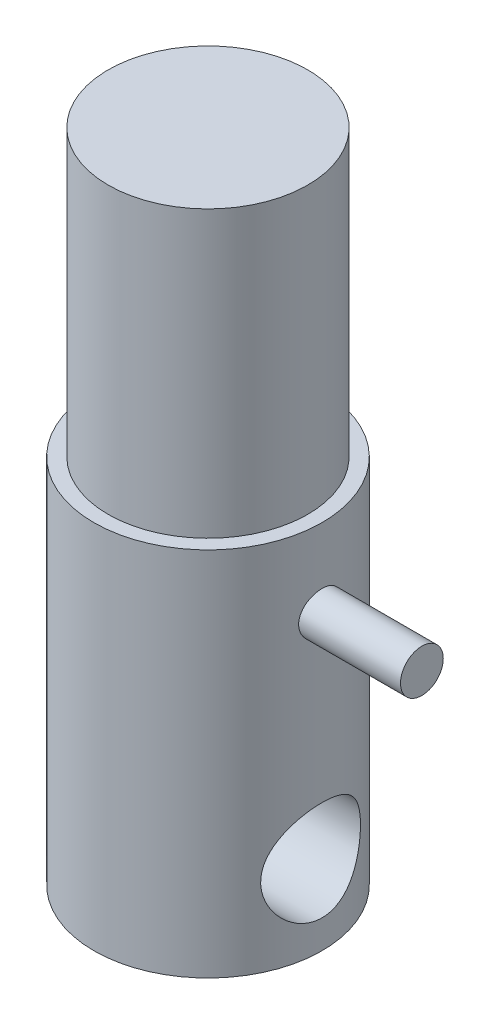
ISO-10303-21;
HEADER;
FILE_DESCRIPTION(('STEP AP214'),'2;1');
FILE_NAME('part.step','',(''),(''),'','','');
FILE_SCHEMA(('AUTOMOTIVE_DESIGN { 1 0 10303 214 1 1 1 1 }'));
ENDSEC;
DATA;
#1=APPLICATION_CONTEXT('core data for automotive mechanical design processes');
#2=APPLICATION_PROTOCOL_DEFINITION('international standard','automotive_design',2000,#1);
#3=PRODUCT_CONTEXT('',#1,'mechanical');
#4=PRODUCT('Part','Part','',(#3));
#5=PRODUCT_RELATED_PRODUCT_CATEGORY('part','',(#4));
#6=PRODUCT_DEFINITION_FORMATION('','',#4);
#7=PRODUCT_DEFINITION_CONTEXT('part definition',#1,'design');
#8=PRODUCT_DEFINITION('design','',#6,#7);
#9=PRODUCT_DEFINITION_SHAPE('','',#8);
#10=(LENGTH_UNIT() NAMED_UNIT(*) SI_UNIT(.MILLI.,.METRE.));
#11=(NAMED_UNIT(*) PLANE_ANGLE_UNIT() SI_UNIT($,.RADIAN.));
#12=(NAMED_UNIT(*) SI_UNIT($,.STERADIAN.) SOLID_ANGLE_UNIT());
#13=UNCERTAINTY_MEASURE_WITH_UNIT(LENGTH_MEASURE(1.E-05),#10,'distance_accuracy_value','');
#14=(GEOMETRIC_REPRESENTATION_CONTEXT(3) GLOBAL_UNCERTAINTY_ASSIGNED_CONTEXT((#13)) GLOBAL_UNIT_ASSIGNED_CONTEXT((#10,
#11,#12)) REPRESENTATION_CONTEXT('',''));
#15=CARTESIAN_POINT('',(0.,0.,0.));
#16=DIRECTION('',(0.,0.,1.));
#17=DIRECTION('',(1.,0.,0.));
#18=AXIS2_PLACEMENT_3D('',#15,#16,#17);
#19=CARTESIAN_POINT('',(0.,26.,0.));
#20=DIRECTION('',(0.,-1.,0.));
#21=DIRECTION('',(0.,0.,-1.));
#22=AXIS2_PLACEMENT_3D('',#19,#20,#21);
#23=CYLINDRICAL_SURFACE('',#22,8.);
#24=CARTESIAN_POINT('',(-8.,2.,0.));
#25=CARTESIAN_POINT('',(-7.99999940745694,2.00000072776569,-0.0933666233384851));
#26=CARTESIAN_POINT('',(-7.9983610310427,2.00374114328425,-0.186759270174456));
#27=CARTESIAN_POINT('',(-7.99184884919447,2.01866528787146,-0.372872749123498));
#28=CARTESIAN_POINT('',(-7.98697314459621,2.02985338610016,-0.465593154572551));
#29=CARTESIAN_POINT('',(-7.97410005318315,2.05958530422893,-0.649818158985985));
#30=CARTESIAN_POINT('',(-7.96609668064456,2.07814322959752,-0.741320076696438));
#31=CARTESIAN_POINT('',(-7.94718176432595,2.12241334749227,-0.922281183072893));
#32=CARTESIAN_POINT('',(-7.93626903181754,2.14812846454748,-1.01173952049993));
#33=CARTESIAN_POINT('',(-7.8996564478936,2.23543171716823,-1.27542538874324));
#34=CARTESIAN_POINT('',(-7.87001818767712,2.30731913041274,-1.44582497530953));
#35=CARTESIAN_POINT('',(-7.80309271058877,2.4760575708123,-1.77187524727301));
#36=CARTESIAN_POINT('',(-7.76580738177035,2.57290243750859,-1.92752955942217));
#37=CARTESIAN_POINT('',(-7.68500313686328,2.79437449119043,-2.22849129689962));
#38=CARTESIAN_POINT('',(-7.64126685323877,2.92014077858952,-2.3729035023048));
#39=CARTESIAN_POINT('',(-7.55337918697325,3.19342204187393,-2.63935464804969));
#40=CARTESIAN_POINT('',(-7.50922757985992,3.34094949652132,-2.76138066052511));
#41=CARTESIAN_POINT('',(-7.42272790432067,3.6636342561432,-2.98637987771685));
#42=CARTESIAN_POINT('',(-7.38061606388429,3.83987082055633,-3.0879191314078));
#43=CARTESIAN_POINT('',(-7.32501692307065,4.11649644908337,-3.21656730984867));
#44=CARTESIAN_POINT('',(-7.30774025006469,4.21078782451872,-3.25551675909755));
#45=CARTESIAN_POINT('',(-7.27631558892907,4.40285831757203,-3.32516065933081));
#46=CARTESIAN_POINT('',(-7.26216594101907,4.5006355527825,-3.35585949150439));
#47=CARTESIAN_POINT('',(-7.23817142209289,4.69387047188347,-3.4072920277405));
#48=CARTESIAN_POINT('',(-7.22814362009983,4.78919162392814,-3.42845456085262));
#49=CARTESIAN_POINT('',(-7.21177013630988,4.98153652176254,-3.46276381557314));
#50=CARTESIAN_POINT('',(-7.20542269978883,5.0785594334169,-3.47591435728978));
#51=CARTESIAN_POINT('',(-7.19665363004014,5.27351879851523,-3.49403523986675));
#52=CARTESIAN_POINT('',(-7.1942307225408,5.37145494504514,-3.49900823593647));
#53=CARTESIAN_POINT('',(-7.19339383537363,5.56738614351159,-3.50072458650871));
#54=CARTESIAN_POINT('',(-7.19497961060603,5.6653811914805,-3.49746844415904));
#55=CARTESIAN_POINT('',(-7.20508193766051,5.94133960493196,-3.4766519728511));
#56=CARTESIAN_POINT('',(-7.21824024837257,6.11851852257941,-3.44950030503525));
#57=CARTESIAN_POINT('',(-7.2561765532029,6.46538229734021,-3.36894953544146));
#58=CARTESIAN_POINT('',(-7.28095705439998,6.63506552887732,-3.3155447703615));
#59=CARTESIAN_POINT('',(-7.33989995610935,6.96675561879333,-3.18295826773355));
#60=CARTESIAN_POINT('',(-7.37425836136428,7.12850854629243,-3.10323077266952));
#61=CARTESIAN_POINT('',(-7.44845615501834,7.43700203170891,-2.92064956725936));
#62=CARTESIAN_POINT('',(-7.48829781531941,7.58373632271414,-2.81778625968343));
#63=CARTESIAN_POINT('',(-7.57352503128819,7.87256977145236,-2.58051119968252));
#64=CARTESIAN_POINT('',(-7.61907951125158,8.01293402132747,-2.44404178627651));
#65=CARTESIAN_POINT('',(-7.70746776961742,8.26939989092557,-2.14909967075973));
#66=CARTESIAN_POINT('',(-7.75030077257194,8.38549461676629,-1.99062073795121));
#67=CARTESIAN_POINT('',(-7.82990525792128,8.59303595507949,-1.65042312625341));
#68=CARTESIAN_POINT('',(-7.86647502935365,8.68370726769191,-1.46818069446751));
#69=CARTESIAN_POINT('',(-7.92785093023804,8.83248275917373,-1.08901847833019));
#70=CARTESIAN_POINT('',(-7.95266424157327,8.89060682473099,-0.892107739984553));
#71=CARTESIAN_POINT('',(-7.98634708358691,8.96884574673018,-0.503637618390162));
#72=CARTESIAN_POINT('',(-7.99618954872041,8.99128483256231,-0.312630833697039));
#73=CARTESIAN_POINT('',(-8.00198066611261,9.0045317898191,0.070660162758491));
#74=CARTESIAN_POINT('',(-7.99793384423919,8.99534996501364,0.262943938029492));
#75=CARTESIAN_POINT('',(-7.97702184221024,8.94721540381594,0.631984322613553));
#76=CARTESIAN_POINT('',(-7.96088593111326,8.90995573218512,0.809008015466778));
#77=CARTESIAN_POINT('',(-7.91823126268307,8.80914858685033,1.15406028529729));
#78=CARTESIAN_POINT('',(-7.89171122989916,8.74559788384314,1.32208775441223));
#79=CARTESIAN_POINT('',(-7.82976301960118,8.59196921041588,1.65033132337633));
#80=CARTESIAN_POINT('',(-7.79408238501599,8.50112439872629,1.81013928918031));
#81=CARTESIAN_POINT('',(-7.71753886001168,8.29632276718931,2.11281959223004));
#82=CARTESIAN_POINT('',(-7.67667373216661,8.18235595598548,2.25568456572717));
#83=CARTESIAN_POINT('',(-7.59015886424924,7.92413599247671,2.53221082051266));
#84=CARTESIAN_POINT('',(-7.54438505468226,7.77820993718209,2.66427505427857));
#85=CARTESIAN_POINT('',(-7.4559619109918,7.46565728970526,2.90255447133245));
#86=CARTESIAN_POINT('',(-7.41331357936267,7.29902410152598,3.00876138605279));
#87=CARTESIAN_POINT('',(-7.33536965936314,6.94499611802928,3.19416927523349));
#88=CARTESIAN_POINT('',(-7.30024707484556,6.75723913291564,3.27275701612806));
#89=CARTESIAN_POINT('',(-7.24352853325891,6.36912143404663,3.39647014281916));
#90=CARTESIAN_POINT('',(-7.22191987363783,6.16877275156054,3.44162695971624));
#91=CARTESIAN_POINT('',(-7.19675148830959,5.77904723701151,3.49392806332877));
#92=CARTESIAN_POINT('',(-7.19184395387172,5.59013780246139,3.50391337012318));
#93=CARTESIAN_POINT('',(-7.19699182683936,5.21340575258161,3.49332929204513));
#94=CARTESIAN_POINT('',(-7.20704429994488,5.02558293137394,3.47276589908609));
#95=CARTESIAN_POINT('',(-7.23969557058746,4.66736373574051,3.40413157782428));
#96=CARTESIAN_POINT('',(-7.26155308638316,4.49658243461537,3.35768117605106));
#97=CARTESIAN_POINT('',(-7.314696983464,4.16524175581869,3.24026804281403));
#98=CARTESIAN_POINT('',(-7.34598606978349,4.00468532672859,3.16929827818656));
#99=CARTESIAN_POINT('',(-7.41691389199545,3.68724732086641,2.99972215982));
#100=CARTESIAN_POINT('',(-7.45695538174172,3.53123947088067,2.89965250748851));
#101=CARTESIAN_POINT('',(-7.53987396135868,3.2373434644452,2.67664641192364));
#102=CARTESIAN_POINT('',(-7.58275218306895,3.09946260690557,2.55370080542336));
#103=CARTESIAN_POINT('',(-7.67081412171126,2.83384332403758,2.27629404761518));
#104=CARTESIAN_POINT('',(-7.71589060269956,2.7079185047839,2.12005678093358));
#105=CARTESIAN_POINT('',(-7.79975654698931,2.48387123016398,1.78694890691637));
#106=CARTESIAN_POINT('',(-7.83854315030181,2.38576140710847,1.61006897593106));
#107=CARTESIAN_POINT('',(-7.88851654672204,2.26270994366492,1.33415687261996));
#108=CARTESIAN_POINT('',(-7.90374047219448,2.22585948111051,1.24100056486648));
#109=CARTESIAN_POINT('',(-7.93117343765623,2.16017812675487,1.05148749258175));
#110=CARTESIAN_POINT('',(-7.94338392358637,2.13134338792028,0.955132288258783));
#111=CARTESIAN_POINT('',(-7.96440212131287,2.08207743982284,0.760193676811341));
#112=CARTESIAN_POINT('',(-7.97321803392498,2.0616259699275,0.661616256555896));
#113=CARTESIAN_POINT('',(-7.98721905528973,2.02928204376553,0.46286048408385));
#114=CARTESIAN_POINT('',(-7.99240672252557,2.01738355613737,0.362683311033652));
#115=CARTESIAN_POINT('',(-7.99713341137932,2.00655629531713,0.218553661526454));
#116=CARTESIAN_POINT('',(-7.9982075948169,2.00409857473238,0.174888452463559));
#117=CARTESIAN_POINT('',(-7.99964103120386,2.00082024910779,0.0874840669291023));
#118=CARTESIAN_POINT('',(-8.00000027762309,1.9999996590213,0.0437448897855761));
#119=CARTESIAN_POINT('',(-8.,2.,0.));
#120=B_SPLINE_CURVE_WITH_KNOTS('',3,(#24,#25,#26,#27,#28,#29,#30,#31,#32,#33,#34,#35,#36,#37,
#38,#39,#40,#41,#42,#43,#44,#45,#46,#47,#48,#49,#50,#51,#52,#53,#54,#55,#56,#57,#58,#59,#60,#61,
#62,#63,#64,#65,#66,#67,#68,#69,#70,#71,#72,#73,#74,#75,#76,#77,#78,#79,#80,#81,#82,#83,#84,#85,
#86,#87,#88,#89,#90,#91,#92,#93,#94,#95,#96,#97,#98,#99,#100,#101,#102,#103,#104,#105,#106,#107,
#108,#109,#110,#111,#112,#113,#114,#115,#116,#117,#118,#119),.UNSPECIFIED.,.T.,.F.,(4,2,2,2,2,2,
2,2,2,2,2,2,2,2,2,2,2,2,2,2,2,2,2,2,2,2,2,2,2,2,2,2,2,2,2,2,2,2,2,2,2,2,2,2,2,2,2,4),(0.,
0.280055584979429,0.560275608660799,0.841034563983177,1.12190841020988,1.68106412368011,
2.24008194800942,2.82680710491311,3.41387003201822,4.03352664902797,4.34358783038556,
4.65348403828972,4.94755489231978,5.24148542375168,5.53532049850808,5.8291376079696,
6.36557090281265,6.90211996753041,7.45057649543578,7.99926095582188,8.59956705409407,
9.20004344137123,9.81722001554683,10.4340190761369,11.0087042415314,11.5832021617381,
12.1255823026808,12.6680290834668,13.2274255319804,13.787064220754,14.3905316391227,
14.9941917795785,15.6105148076093,16.2262576423399,16.7909530261817,17.3555376636034,
17.8882098830464,18.4210350218617,18.9875386040729,19.5542695972419,20.1684143748548,
20.7828376240217,21.0864890930043,21.3899945761573,21.6927621618725,21.9953160330114,
22.126528755107,22.2577426756784),.UNSPECIFIED.);
#121=CARTESIAN_POINT('',(-8.,2.,0.));
#122=VERTEX_POINT('',#121);
#123=EDGE_CURVE('E46',#122,#122,#120,.T.);
#124=ORIENTED_EDGE('',*,*,#123,.T.);
#125=EDGE_LOOP('',(#124));
#126=FACE_BOUND('',#125,.T.);
#127=CARTESIAN_POINT('',(7.19374728496908,5.5,-3.5));
#128=CARTESIAN_POINT('',(7.19374810386139,5.40711580727037,-3.49999924162591));
#129=CARTESIAN_POINT('',(7.195552591324,5.31420402387926,-3.49629701211786));
#130=CARTESIAN_POINT('',(7.20270938170248,5.12906637139116,-3.48152873498354));
#131=CARTESIAN_POINT('',(7.20806384836129,5.03684095533005,-3.47045819629321));
#132=CARTESIAN_POINT('',(7.222150121289,4.85362075321833,-3.44104849865272));
#133=CARTESIAN_POINT('',(7.23088870157991,4.76262881677112,-3.4226947589981));
#134=CARTESIAN_POINT('',(7.25144299898467,4.58270157862844,-3.37892773215976));
#135=CARTESIAN_POINT('',(7.26326001919297,4.49376716527606,-3.35351145512055));
#136=CARTESIAN_POINT('',(7.30265351366532,4.23179187946308,-3.26730320684374));
#137=CARTESIAN_POINT('',(7.33425687700048,4.06256720174166,-3.19638630709682));
#138=CARTESIAN_POINT('',(7.40456425480857,3.7385504530973,-3.02994099854803));
#139=CARTESIAN_POINT('',(7.44326709343807,3.58375599857687,-2.93441666426989));
#140=CARTESIAN_POINT('',(7.52639203685626,3.28214543344299,-2.71441978812207));
#141=CARTESIAN_POINT('',(7.57102032945095,3.1364300624805,-2.58851272804752));
#142=CARTESIAN_POINT('',(7.65928051446386,2.86736499540207,-2.31433707544347));
#143=CARTESIAN_POINT('',(7.70291199271141,2.74402445331774,-2.1660593758338));
#144=CARTESIAN_POINT('',(7.78681224923818,2.51737087750044,-1.84249418425965));
#145=CARTESIAN_POINT('',(7.82681388614936,2.41532527768132,-1.6662431533408));
#146=CARTESIAN_POINT('',(7.89639038449389,2.24281754141211,-1.29700633814233));
#147=CARTESIAN_POINT('',(7.92597032389417,2.17234001887735,-1.10402876113679));
#148=CARTESIAN_POINT('',(7.96990406372881,2.06904842757031,-0.718416174675191));
#149=CARTESIAN_POINT('',(7.98502582197088,2.03432608831748,-0.52638165713002));
#150=CARTESIAN_POINT('',(8.0011470433507,1.99733674559993,-0.138657572174806));
#151=CARTESIAN_POINT('',(8.0021528621905,1.99505513568999,0.0570303105634126));
#152=CARTESIAN_POINT('',(7.99036092992955,2.02207281123444,0.432523493194875));
#153=CARTESIAN_POINT('',(7.97848310947173,2.04926731902441,0.612514780670003));
#154=CARTESIAN_POINT('',(7.94355200453376,2.13082049910648,0.965077636002544));
#155=CARTESIAN_POINT('',(7.92049789308317,2.18518118152222,1.13764865378098));
#156=CARTESIAN_POINT('',(7.86497073165481,2.32012712471104,1.47367052528374));
#157=CARTESIAN_POINT('',(7.83235908243803,2.40110057551526,1.6369416313634));
#158=CARTESIAN_POINT('',(7.76084888229163,2.58656754547184,1.9480082145536));
#159=CARTESIAN_POINT('',(7.72194805329477,2.69106959256008,2.09579805195117));
#160=CARTESIAN_POINT('',(7.63818965434226,2.92990657523495,2.38374348618942));
#161=CARTESIAN_POINT('',(7.59310405092498,3.06591307262641,2.52244815341146));
#162=CARTESIAN_POINT('',(7.50421764556364,3.35925115219584,2.77574754411056));
#163=CARTESIAN_POINT('',(7.46041745330949,3.51659266120924,2.8903309806441));
#164=CARTESIAN_POINT('',(7.37733443053267,3.85588520111853,3.09641603024862));
#165=CARTESIAN_POINT('',(7.33829703470219,4.03856076336231,3.18683253318893));
#166=CARTESIAN_POINT('',(7.27216228687629,4.41870019485369,3.33501369954439));
#167=CARTESIAN_POINT('',(7.24505539175188,4.61615209612936,3.39280447056732));
#168=CARTESIAN_POINT('',(7.20829029004221,5.00566140160325,3.47019817639973));
#169=CARTESIAN_POINT('',(7.19755271038879,5.19714380650489,3.49217078113949));
#170=CARTESIAN_POINT('',(7.19164734495363,5.58132000687661,3.50432275117929));
#171=CARTESIAN_POINT('',(7.1964731811466,5.77401327382121,3.49451514028461));
#172=CARTESIAN_POINT('',(7.22002683772364,6.14012622876593,3.4455526814594));
#173=CARTESIAN_POINT('',(7.23770315974911,6.31391928563731,3.40861549221784));
#174=CARTESIAN_POINT('',(7.2835719031437,6.65265881830396,3.30946240027108));
#175=CARTESIAN_POINT('',(7.31176695651541,6.81760306812082,3.24724017038138));
#176=CARTESIAN_POINT('',(7.37700556328255,7.14214174168271,3.09625821412789));
#177=CARTESIAN_POINT('',(7.41438531625931,7.30117690035965,3.00644649823369));
#178=CARTESIAN_POINT('',(7.49334745973603,7.6027309569266,2.80384639185941));
#179=CARTESIAN_POINT('',(7.53493178644894,7.745242180073,2.69104739119354));
#180=CARTESIAN_POINT('',(7.62220440912904,8.02329157558212,2.43353628510447));
#181=CARTESIAN_POINT('',(7.667920130692,8.15699920395048,2.28684872682841));
#182=CARTESIAN_POINT('',(7.75483002038135,8.39828856761229,1.97211567478382));
#183=CARTESIAN_POINT('',(7.79602363407805,8.50586710132364,1.80406756755922));
#184=CARTESIAN_POINT('',(7.86972416311158,8.69216925039147,1.44929175543346));
#185=CARTESIAN_POINT('',(7.90216932302596,8.77068911713165,1.26244341673124));
#186=CARTESIAN_POINT('',(7.95422986567818,8.89454870101601,0.876389188577478));
#187=CARTESIAN_POINT('',(7.97385375317964,8.9399104154101,0.677191587015467));
#188=CARTESIAN_POINT('',(7.99699248489773,8.99319392730258,0.288364722920608));
#189=CARTESIAN_POINT('',(8.00161387378577,9.00368892190881,0.0991519235269346));
#190=CARTESIAN_POINT('',(7.99738301407877,8.99401794639169,-0.278312727812992));
#191=CARTESIAN_POINT('',(7.98853357994741,8.97385838093702,-0.466564772245541));
#192=CARTESIAN_POINT('',(7.95896503372035,8.90529243150902,-0.828558340282559));
#193=CARTESIAN_POINT('',(7.93876044800974,8.85810889998386,-1.00257718874902));
#194=CARTESIAN_POINT('',(7.88880398035049,8.7382382504519,-1.34011448479635));
#195=CARTESIAN_POINT('',(7.85905038678186,8.66554655999524,-1.50363104357448));
#196=CARTESIAN_POINT('',(7.79113325789052,8.49304583687023,-1.82380144949655));
#197=CARTESIAN_POINT('',(7.75264698316149,8.39214739585566,-1.97979807623585));
#198=CARTESIAN_POINT('',(7.67171345978097,8.16760934849675,-2.27333076742612));
#199=CARTESIAN_POINT('',(7.62926458324677,8.04396037553606,-2.41085918784562));
#200=CARTESIAN_POINT('',(7.54108919775903,7.76641680822966,-2.67445994810721));
#201=CARTESIAN_POINT('',(7.49535905081082,7.61093674478461,-2.7988644366519));
#202=CARTESIAN_POINT('',(7.4089572896164,7.2799044785009,-3.02018655942774));
#203=CARTESIAN_POINT('',(7.36828874008277,7.10434023729188,-3.11708758579798));
#204=CARTESIAN_POINT('',(7.3149676513268,6.82925322575531,-3.23932393250487));
#205=CARTESIAN_POINT('',(7.29845827313891,6.73547492168327,-3.27624880498005));
#206=CARTESIAN_POINT('',(7.26859205620314,6.54464685488138,-3.34198696460523));
#207=CARTESIAN_POINT('',(7.25523364692276,6.44759874959793,-3.37080429417159));
#208=CARTESIAN_POINT('',(7.23220935810956,6.25122580388531,-3.41992432481987));
#209=CARTESIAN_POINT('',(7.22253377778016,6.15190768557113,-3.44024940900547));
#210=CARTESIAN_POINT('',(7.20721980624573,5.95162686897024,-3.4722184213251));
#211=CARTESIAN_POINT('',(7.20157835544636,5.85066547655535,-3.48386892877284));
#212=CARTESIAN_POINT('',(7.1966303346444,5.70787748852753,-3.49406912650475));
#213=CARTESIAN_POINT('',(7.19555017493484,5.66634309981263,-3.4962923535744));
#214=CARTESIAN_POINT('',(7.19410845874014,5.58320765373032,-3.4992579765569));
#215=CARTESIAN_POINT('',(7.19374691815402,5.54160659490823,-3.50000033970649));
#216=CARTESIAN_POINT('',(7.19374728496908,5.5,-3.5));
#217=B_SPLINE_CURVE_WITH_KNOTS('',3,(#127,#128,#129,#130,#131,#132,#133,#134,#135,#136,#137,
#138,#139,#140,#141,#142,#143,#144,#145,#146,#147,#148,#149,#150,#151,#152,#153,#154,#155,#156,
#157,#158,#159,#160,#161,#162,#163,#164,#165,#166,#167,#168,#169,#170,#171,#172,#173,#174,#175,
#176,#177,#178,#179,#180,#181,#182,#183,#184,#185,#186,#187,#188,#189,#190,#191,#192,#193,#194,
#195,#196,#197,#198,#199,#200,#201,#202,#203,#204,#205,#206,#207,#208,#209,#210,#211,#212,#213,
#214,#215,#216),.UNSPECIFIED.,.T.,.F.,(4,2,2,2,2,2,2,2,2,2,2,2,2,2,2,2,2,2,2,2,2,2,2,2,2,2,2,2,
2,2,2,2,2,2,2,2,2,2,2,2,2,2,2,2,4),(0.,0.278609216487988,0.557388404004415,0.836728535982833,
1.1161871044853,1.6720571813797,2.22783527584397,2.81829715118985,3.40900005525299,
4.02846223941722,4.6476221721533,5.23168971423401,5.81549427144895,6.36020072666528,
6.90494749265348,7.45802177092596,8.01129683451208,8.60693414407942,9.20284955114769,
9.82220340201623,10.4410609314244,11.0170153819179,11.5927338311872,12.1259938721361,
12.6593874352903,13.2163720059158,13.7736142472311,14.3818335358021,14.9901273115594,
15.6026088477598,16.2146836915969,16.7804456855733,17.3460894909254,17.8879587889252,
18.4299252690434,18.9967115641466,19.5637317349961,20.1738949205377,20.7844257707195,
21.090465016232,21.3963513992251,21.7014263892008,22.0062697558366,22.1310673560547,
22.255867717316),.UNSPECIFIED.);
#218=CARTESIAN_POINT('',(7.19374728496908,5.5,-3.5));
#219=VERTEX_POINT('',#218);
#220=EDGE_CURVE('E57',#219,#219,#217,.T.);
#221=ORIENTED_EDGE('',*,*,#220,.T.);
#222=EDGE_LOOP('',(#221));
#223=FACE_BOUND('',#222,.T.);
#224=CARTESIAN_POINT('',(0.,26.,0.));
#225=DIRECTION('',(0.,1.,0.));
#226=DIRECTION('',(0.,0.,1.));
#227=AXIS2_PLACEMENT_3D('',#224,#225,#226);
#228=CIRCLE('',#227,8.);
#229=CARTESIAN_POINT('',(0.,26.,8.));
#230=VERTEX_POINT('',#229);
#231=EDGE_CURVE('E54',#230,#230,#228,.T.);
#232=ORIENTED_EDGE('',*,*,#231,.F.);
#233=EDGE_LOOP('',(#232));
#234=FACE_BOUND('',#233,.T.);
#235=CARTESIAN_POINT('',(0.,0.,0.));
#236=DIRECTION('',(0.,1.,0.));
#237=DIRECTION('',(0.,0.,1.));
#238=AXIS2_PLACEMENT_3D('',#235,#236,#237);
#239=CIRCLE('',#238,8.);
#240=CARTESIAN_POINT('',(0.,0.,8.));
#241=VERTEX_POINT('',#240);
#242=EDGE_CURVE('E53',#241,#241,#239,.T.);
#243=ORIENTED_EDGE('',*,*,#242,.T.);
#244=EDGE_LOOP('',(#243));
#245=FACE_BOUND('',#244,.T.);
#246=CARTESIAN_POINT('',(7.85811682275085,20.5,1.5));
#247=CARTESIAN_POINT('',(7.85811843793493,20.4165427919883,1.49999679883246));
#248=CARTESIAN_POINT('',(7.85946079760266,20.3330440517816,1.49301126348936));
#249=CARTESIAN_POINT('',(7.86467851014364,20.1684010384181,1.46527253251805));
#250=CARTESIAN_POINT('',(7.86855601173205,20.0872588235725,1.44450765768477));
#251=CARTESIAN_POINT('',(7.87838976464884,19.9297349286291,1.38987035617788));
#252=CARTESIAN_POINT('',(7.88434407905997,19.8533488906927,1.35601013954374));
#253=CARTESIAN_POINT('',(7.89765826320959,19.7073464407132,1.27617565760366));
#254=CARTESIAN_POINT('',(7.90501802325621,19.6377295009967,1.23020233759193));
#255=CARTESIAN_POINT('',(7.92041614838944,19.5063698008009,1.12683678942622));
#256=CARTESIAN_POINT('',(7.92846116625679,19.4447235165283,1.06932292933092));
#257=CARTESIAN_POINT('',(7.94426457664034,19.3318956104004,0.944771778803553));
#258=CARTESIAN_POINT('',(7.95202295031152,19.2807146755752,0.877733863624946));
#259=CARTESIAN_POINT('',(7.96645017828405,19.1899006233995,0.735403894570163));
#260=CARTESIAN_POINT('',(7.97311028052363,19.1503584664806,0.660052840033866));
#261=CARTESIAN_POINT('',(7.9845160863293,19.0845304577265,0.503631283250762));
#262=CARTESIAN_POINT('',(7.98926194728334,19.0582435160098,0.422561251859505));
#263=CARTESIAN_POINT('',(7.99625755123778,19.0199704513889,0.258002746187415));
#264=CARTESIAN_POINT('',(7.99853565976327,19.0078216940773,0.174553323244857));
#265=CARTESIAN_POINT('',(8.00043684615594,18.9976631122996,0.00677167603538293));
#266=CARTESIAN_POINT('',(8.00006015010697,18.9996520838609,-0.0775604724476702));
#267=CARTESIAN_POINT('',(7.99671633763241,19.0175877711471,-0.243598357899397));
#268=CARTESIAN_POINT('',(7.99378172247214,19.03335936943,-0.325323760451469));
#269=CARTESIAN_POINT('',(7.98568826333561,19.0781356493952,-0.484947165715475));
#270=CARTESIAN_POINT('',(7.98052933829966,19.1071408133458,-0.56284502882654));
#271=CARTESIAN_POINT('',(7.96851260297339,19.1777277310583,-0.713110065751521));
#272=CARTESIAN_POINT('',(7.96164537590825,19.2193794879125,-0.785443571838533));
#273=CARTESIAN_POINT('',(7.9469714754285,19.3140256690772,-0.922159977214639));
#274=CARTESIAN_POINT('',(7.93916470651164,19.3670212468876,-0.986542066910785));
#275=CARTESIAN_POINT('',(7.92333513680567,19.4838157029835,-1.10656561896904));
#276=CARTESIAN_POINT('',(7.91531085901621,19.5477677839021,-1.16205790757041));
#277=CARTESIAN_POINT('',(7.90006508924621,19.6841495312786,-1.2615517185126));
#278=CARTESIAN_POINT('',(7.89284360901351,19.7565793217646,-1.30555307271182));
#279=CARTESIAN_POINT('',(7.88001893307121,19.9080582707027,-1.38085852224478));
#280=CARTESIAN_POINT('',(7.87441850530261,19.9871184571906,-1.41214093645421));
#281=CARTESIAN_POINT('',(7.86551242396689,20.1495011841232,-1.46093656975056));
#282=CARTESIAN_POINT('',(7.86220651038619,20.2328232404648,-1.47845134901108));
#283=CARTESIAN_POINT('',(7.85831520301005,20.4000193288559,-1.49899672649739));
#284=CARTESIAN_POINT('',(7.85768955816136,20.4838661155655,-1.50224164285859));
#285=CARTESIAN_POINT('',(7.8591219142084,20.6509034550871,-1.49472968881725));
#286=CARTESIAN_POINT('',(7.86117978238611,20.7340940401481,-1.48397351086433));
#287=CARTESIAN_POINT('',(7.86770980063205,20.8967529030544,-1.44894868195883));
#288=CARTESIAN_POINT('',(7.87216186690878,20.9762462526249,-1.4247923858399));
#289=CARTESIAN_POINT('',(7.88296134156618,21.1300571897302,-1.3637722437906));
#290=CARTESIAN_POINT('',(7.88930888963281,21.2043743953153,-1.32690746128795));
#291=CARTESIAN_POINT('',(7.90327577863685,21.3466676190432,-1.2410235311966));
#292=CARTESIAN_POINT('',(7.91090895425315,21.4145605378661,-1.19186899639621));
#293=CARTESIAN_POINT('',(7.926548113681,21.5412120402143,-1.08298344344247));
#294=CARTESIAN_POINT('',(7.93455413096493,21.5999698015558,-1.02325147433084));
#295=CARTESIAN_POINT('',(7.95016624005945,21.7074837635341,-0.893949417870386));
#296=CARTESIAN_POINT('',(7.95776555833305,21.756095826606,-0.824258534095891));
#297=CARTESIAN_POINT('',(7.9715940481035,21.8409212061777,-0.67757452304014));
#298=CARTESIAN_POINT('',(7.97782327234725,21.877135000025,-0.600581677038529));
#299=CARTESIAN_POINT('',(7.98818057995847,21.9359200978641,-0.441877541578685));
#300=CARTESIAN_POINT('',(7.99231954730142,21.9585621875614,-0.36019321307899));
#301=CARTESIAN_POINT('',(7.99807642083745,21.9897870482899,-0.194096227381573));
#302=CARTESIAN_POINT('',(7.99969459229933,21.9983712986627,-0.109683858215853));
#303=CARTESIAN_POINT('',(8.00022227515441,22.0011853015184,0.0580907602505072));
#304=CARTESIAN_POINT('',(7.99917286625032,21.9956327531295,0.141449307066266));
#305=CARTESIAN_POINT('',(7.99456866611702,21.9708075722316,0.306023369279198));
#306=CARTESIAN_POINT('',(7.99101389890671,21.9515350712558,0.387238905213688));
#307=CARTESIAN_POINT('',(7.98179837978045,21.8999087926163,0.545106475595484));
#308=CARTESIAN_POINT('',(7.97614135981576,21.867578187119,0.621766319318223));
#309=CARTESIAN_POINT('',(7.96333372068771,21.7907795463448,0.768605631316694));
#310=CARTESIAN_POINT('',(7.95618300146483,21.7463106978933,0.83878466500327));
#311=CARTESIAN_POINT('',(7.94104779859941,21.6457485455577,0.971755027780005));
#312=CARTESIAN_POINT('',(7.93305284591272,21.5894979661383,1.03442623539053));
#313=CARTESIAN_POINT('',(7.91719633538833,21.4672954375073,1.14951536065485));
#314=CARTESIAN_POINT('',(7.90933480936764,21.4013412096263,1.2019308632478));
#315=CARTESIAN_POINT('',(7.89455577425926,21.2608735452967,1.29547633945385));
#316=CARTESIAN_POINT('',(7.88764767280728,21.1862865603324,1.33649740531872));
#317=CARTESIAN_POINT('',(7.87567084650033,21.0311742100203,1.40536132423417));
#318=CARTESIAN_POINT('',(7.87060038649116,20.9506545334106,1.43321661638912));
#319=CARTESIAN_POINT('',(7.86393016292125,20.8082477119341,1.46929726596175));
#320=CARTESIAN_POINT('',(7.86176310717932,20.7471942762381,1.48079105739851));
#321=CARTESIAN_POINT('',(7.85885585595504,20.6241015315797,1.49614351076215));
#322=CARTESIAN_POINT('',(7.85811562163282,20.5620622494997,1.50000238052127));
#323=CARTESIAN_POINT('',(7.85811682275085,20.5,1.5));
#324=B_SPLINE_CURVE_WITH_KNOTS('',3,(#246,#247,#248,#249,#250,#251,#252,#253,#254,#255,#256,
#257,#258,#259,#260,#261,#262,#263,#264,#265,#266,#267,#268,#269,#270,#271,#272,#273,#274,#275,
#276,#277,#278,#279,#280,#281,#282,#283,#284,#285,#286,#287,#288,#289,#290,#291,#292,#293,#294,
#295,#296,#297,#298,#299,#300,#301,#302,#303,#304,#305,#306,#307,#308,#309,#310,#311,#312,#313,
#314,#315,#316,#317,#318,#319,#320,#321,#322,#323),.UNSPECIFIED.,.T.,.F.,(4,2,2,2,2,2,2,2,2,2,2,
2,2,2,2,2,2,2,2,2,2,2,2,2,2,2,2,2,2,2,2,2,2,2,2,2,2,2,4),(0.,0.250144505793185,
0.500501302380392,0.75062522797843,1.00072963993908,1.25362335698691,1.50653367069315,
1.76137104348047,2.0161874593964,2.26804275460261,2.51987660200648,2.76855650598725,
3.01724547328425,3.26733691984219,3.51745380911786,3.77140614764064,4.025362201924,
4.27974936118266,4.53410768866488,4.78463248587075,5.03514489338718,5.28358792315369,
5.53204926624318,5.78337862654144,6.03473059394677,6.28944125495871,6.54414210821705,
6.79750269418683,7.0508366166733,7.30029300570138,7.54974700322167,7.79876026530358,
8.0477902135711,8.30038464008745,8.55303847730765,8.80803001818118,9.0627801574912,
9.24880307527215,9.43482092920425),.UNSPECIFIED.);
#325=CARTESIAN_POINT('',(7.85811682275085,20.5,1.5));
#326=VERTEX_POINT('',#325);
#327=EDGE_CURVE('E34',#326,#326,#324,.T.);
#328=ORIENTED_EDGE('',*,*,#327,.F.);
#329=EDGE_LOOP('',(#328));
#330=FACE_BOUND('',#329,.T.);
#331=ADVANCED_FACE('F30',(#126,#223,#234,#245,#330),#23,.T.);
#332=CARTESIAN_POINT('',(0.,26.,0.));
#333=DIRECTION('',(0.,1.,0.));
#334=DIRECTION('',(0.,0.,1.));
#335=AXIS2_PLACEMENT_3D('',#332,#333,#334);
#336=PLANE('',#335);
#337=CARTESIAN_POINT('',(0.,26.,0.));
#338=DIRECTION('',(0.,1.,0.));
#339=DIRECTION('',(0.,0.,1.));
#340=AXIS2_PLACEMENT_3D('',#337,#338,#339);
#341=CIRCLE('',#340,7.);
#342=CARTESIAN_POINT('',(0.,26.,7.));
#343=VERTEX_POINT('',#342);
#344=EDGE_CURVE('E10',#343,#343,#341,.T.);
#345=ORIENTED_EDGE('',*,*,#344,.F.);
#346=EDGE_LOOP('',(#345));
#347=FACE_BOUND('',#346,.T.);
#348=ORIENTED_EDGE('',*,*,#231,.T.);
#349=EDGE_LOOP('',(#348));
#350=FACE_BOUND('',#349,.T.);
#351=ADVANCED_FACE('F77',(#347,#350),#336,.T.);
#352=CARTESIAN_POINT('',(0.,0.,0.));
#353=DIRECTION('',(0.,1.,0.));
#354=DIRECTION('',(0.,0.,1.));
#355=AXIS2_PLACEMENT_3D('',#352,#353,#354);
#356=PLANE('',#355);
#357=ORIENTED_EDGE('',*,*,#242,.F.);
#358=EDGE_LOOP('',(#357));
#359=FACE_BOUND('',#358,.T.);
#360=ADVANCED_FACE('F73',(#359),#356,.F.);
#361=CARTESIAN_POINT('',(-8.,5.5,0.));
#362=DIRECTION('',(1.,0.,0.));
#363=DIRECTION('',(0.,0.,-1.));
#364=AXIS2_PLACEMENT_3D('',#361,#362,#363);
#365=CYLINDRICAL_SURFACE('',#364,3.5);
#366=ORIENTED_EDGE('',*,*,#220,.F.);
#367=EDGE_LOOP('',(#366));
#368=FACE_BOUND('',#367,.T.);
#369=ORIENTED_EDGE('',*,*,#123,.F.);
#370=EDGE_LOOP('',(#369));
#371=FACE_BOUND('',#370,.T.);
#372=ADVANCED_FACE('F68',(#368,#371),#365,.F.);
#373=CARTESIAN_POINT('',(15.,20.5,0.));
#374=DIRECTION('',(-1.,0.,0.));
#375=DIRECTION('',(0.,0.,1.));
#376=AXIS2_PLACEMENT_3D('',#373,#374,#375);
#377=CYLINDRICAL_SURFACE('',#376,1.5);
#378=CARTESIAN_POINT('',(15.,20.5,0.));
#379=DIRECTION('',(1.,0.,0.));
#380=DIRECTION('',(0.,0.,-1.));
#381=AXIS2_PLACEMENT_3D('',#378,#379,#380);
#382=CIRCLE('',#381,1.5);
#383=CARTESIAN_POINT('',(15.,20.5,-1.5));
#384=VERTEX_POINT('',#383);
#385=EDGE_CURVE('E50',#384,#384,#382,.T.);
#386=ORIENTED_EDGE('',*,*,#385,.F.);
#387=EDGE_LOOP('',(#386));
#388=FACE_BOUND('',#387,.T.);
#389=ORIENTED_EDGE('',*,*,#327,.T.);
#390=EDGE_LOOP('',(#389));
#391=FACE_BOUND('',#390,.T.);
#392=ADVANCED_FACE('F72',(#388,#391),#377,.T.);
#393=CARTESIAN_POINT('',(15.,20.5,0.));
#394=DIRECTION('',(1.,0.,0.));
#395=DIRECTION('',(0.,0.,-1.));
#396=AXIS2_PLACEMENT_3D('',#393,#394,#395);
#397=PLANE('',#396);
#398=ORIENTED_EDGE('',*,*,#385,.T.);
#399=EDGE_LOOP('',(#398));
#400=FACE_BOUND('',#399,.T.);
#401=ADVANCED_FACE('F101',(#400),#397,.T.);
#402=CARTESIAN_POINT('',(0.,46.,0.));
#403=DIRECTION('',(0.,-1.,0.));
#404=DIRECTION('',(0.,0.,-1.));
#405=AXIS2_PLACEMENT_3D('',#402,#403,#404);
#406=CYLINDRICAL_SURFACE('',#405,7.);
#407=CARTESIAN_POINT('',(0.,46.,0.));
#408=DIRECTION('',(0.,1.,0.));
#409=DIRECTION('',(0.,0.,1.));
#410=AXIS2_PLACEMENT_3D('',#407,#408,#409);
#411=CIRCLE('',#410,7.);
#412=CARTESIAN_POINT('',(0.,46.,7.));
#413=VERTEX_POINT('',#412);
#414=EDGE_CURVE('E49',#413,#413,#411,.T.);
#415=ORIENTED_EDGE('',*,*,#414,.F.);
#416=EDGE_LOOP('',(#415));
#417=FACE_BOUND('',#416,.T.);
#418=ORIENTED_EDGE('',*,*,#344,.T.);
#419=EDGE_LOOP('',(#418));
#420=FACE_BOUND('',#419,.T.);
#421=ADVANCED_FACE('F106',(#417,#420),#406,.T.);
#422=CARTESIAN_POINT('',(0.,46.,0.));
#423=DIRECTION('',(0.,1.,0.));
#424=DIRECTION('',(0.,0.,1.));
#425=AXIS2_PLACEMENT_3D('',#422,#423,#424);
#426=PLANE('',#425);
#427=ORIENTED_EDGE('',*,*,#414,.T.);
#428=EDGE_LOOP('',(#427));
#429=FACE_BOUND('',#428,.T.);
#430=ADVANCED_FACE('F112',(#429),#426,.T.);
#431=CLOSED_SHELL('',(#331,#351,#360,#372,#392,#401,#421,#430));
#432=MANIFOLD_SOLID_BREP('B2',#431);
#433=ADVANCED_BREP_SHAPE_REPRESENTATION('',(#18,#432),#14);
#434=SHAPE_DEFINITION_REPRESENTATION(#9,#433);
ENDSEC;
END-ISO-10303-21;
